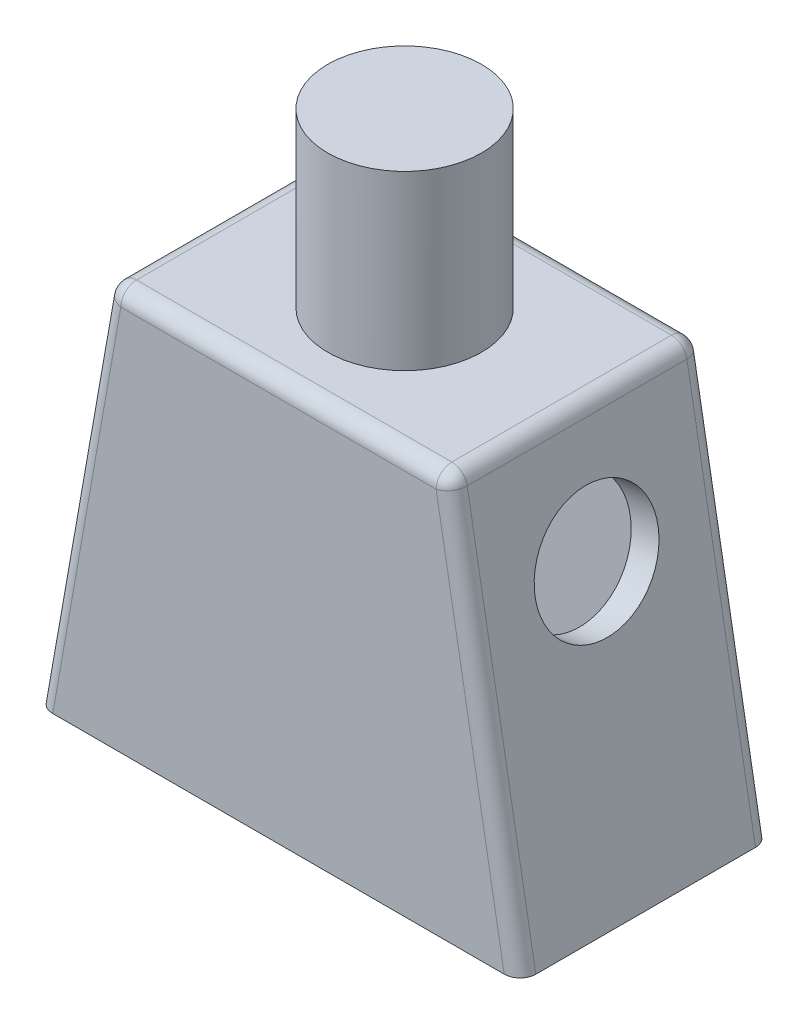
ISO-10303-21;
HEADER;
FILE_DESCRIPTION(('STEP AP214'),'2;1');
FILE_NAME('part.step','',(''),(''),'','','');
FILE_SCHEMA(('AUTOMOTIVE_DESIGN { 1 0 10303 214 1 1 1 1 }'));
ENDSEC;
DATA;
#1=APPLICATION_CONTEXT('core data for automotive mechanical design processes');
#2=APPLICATION_PROTOCOL_DEFINITION('international standard','automotive_design',2000,#1);
#3=PRODUCT_CONTEXT('',#1,'mechanical');
#4=PRODUCT('Part','Part','',(#3));
#5=PRODUCT_RELATED_PRODUCT_CATEGORY('part','',(#4));
#6=PRODUCT_DEFINITION_FORMATION('','',#4);
#7=PRODUCT_DEFINITION_CONTEXT('part definition',#1,'design');
#8=PRODUCT_DEFINITION('design','',#6,#7);
#9=PRODUCT_DEFINITION_SHAPE('','',#8);
#10=(LENGTH_UNIT() NAMED_UNIT(*) SI_UNIT(.MILLI.,.METRE.));
#11=(NAMED_UNIT(*) PLANE_ANGLE_UNIT() SI_UNIT($,.RADIAN.));
#12=(NAMED_UNIT(*) SI_UNIT($,.STERADIAN.) SOLID_ANGLE_UNIT());
#13=UNCERTAINTY_MEASURE_WITH_UNIT(LENGTH_MEASURE(1.E-05),#10,'distance_accuracy_value','');
#14=(GEOMETRIC_REPRESENTATION_CONTEXT(3) GLOBAL_UNCERTAINTY_ASSIGNED_CONTEXT((#13)) GLOBAL_UNIT_ASSIGNED_CONTEXT((#10,
#11,#12)) REPRESENTATION_CONTEXT('',''));
#15=CARTESIAN_POINT('',(0.,0.,0.));
#16=DIRECTION('',(0.,0.,1.));
#17=DIRECTION('',(1.,0.,0.));
#18=AXIS2_PLACEMENT_3D('',#15,#16,#17);
#19=CARTESIAN_POINT('',(0.,0.,8.));
#20=DIRECTION('',(0.984807753012209,-0.173648177666927,0.));
#21=DIRECTION('',(0.173648177666927,0.984807753012209,0.));
#22=AXIS2_PLACEMENT_3D('',#19,#20,#21);
#23=PLANE('',#22);
#24=CARTESIAN_POINT('',(1.56283359900235,8.86326977710988,4.));
#25=DIRECTION('',(-0.984807753012209,0.173648177666927,0.));
#26=DIRECTION('',(-0.173648177666927,-0.984807753012209,0.));
#27=AXIS2_PLACEMENT_3D('',#24,#25,#26);
#28=CIRCLE('',#27,2.);
#29=CARTESIAN_POINT('',(1.21553724366849,6.89365427108546,4.));
#30=VERTEX_POINT('',#29);
#31=EDGE_CURVE('E270',#30,#30,#28,.T.);
#32=ORIENTED_EDGE('',*,*,#31,.F.);
#33=EDGE_LOOP('',(#32));
#34=FACE_BOUND('',#33,.T.);
#35=DIRECTION('',(0.,0.,-1.));
#36=VECTOR('',#35,1.);
#37=CARTESIAN_POINT('',(2.18413129215085,12.3868240888335,8.));
#38=LINE('',#37,#36);
#39=CARTESIAN_POINT('',(2.18413129215085,12.3868240888335,7.5));
#40=VERTEX_POINT('',#39);
#41=CARTESIAN_POINT('',(2.18413129215085,12.3868240888335,0.5));
#42=VERTEX_POINT('',#41);
#43=EDGE_CURVE('E199',#40,#42,#38,.T.);
#44=ORIENTED_EDGE('',*,*,#43,.T.);
#45=DIRECTION('',(-0.173648177666927,-0.984807753012209,0.));
#46=VECTOR('',#45,1.);
#47=CARTESIAN_POINT('',(0.,0.,0.5));
#48=LINE('',#47,#46);
#49=CARTESIAN_POINT('',(0.,0.,0.5));
#50=VERTEX_POINT('',#49);
#51=EDGE_CURVE('E203',#42,#50,#48,.T.);
#52=ORIENTED_EDGE('',*,*,#51,.T.);
#53=DIRECTION('',(0.,0.,-1.));
#54=VECTOR('',#53,1.);
#55=CARTESIAN_POINT('',(0.,0.,8.));
#56=LINE('',#55,#54);
#57=CARTESIAN_POINT('',(0.,0.,7.5));
#58=VERTEX_POINT('',#57);
#59=EDGE_CURVE('E196',#58,#50,#56,.T.);
#60=ORIENTED_EDGE('',*,*,#59,.F.);
#61=DIRECTION('',(-0.173648177666927,-0.984807753012209,0.));
#62=VECTOR('',#61,1.);
#63=CARTESIAN_POINT('',(0.,0.,7.5));
#64=LINE('',#63,#62);
#65=EDGE_CURVE('E201',#58,#40,#64,.F.);
#66=ORIENTED_EDGE('',*,*,#65,.T.);
#67=EDGE_LOOP('',(#44,#52,#60,#66));
#68=FACE_BOUND('',#67,.T.);
#69=ADVANCED_FACE('F39',(#34,#68),#23,.F.);
#70=CARTESIAN_POINT('',(0.,0.,8.));
#71=DIRECTION('',(0.,1.,0.));
#72=DIRECTION('',(0.,0.,1.));
#73=AXIS2_PLACEMENT_3D('',#70,#71,#72);
#74=PLANE('',#73);
#75=DIRECTION('',(0.,0.,1.));
#76=VECTOR('',#75,1.);
#77=CARTESIAN_POINT('',(14.2216255782401,0.,1.5));
#78=LINE('',#77,#76);
#79=CARTESIAN_POINT('',(14.2216255782401,0.,1.5));
#80=VERTEX_POINT('',#79);
#81=CARTESIAN_POINT('',(14.2216255782401,0.,6.5));
#82=VERTEX_POINT('',#81);
#83=EDGE_CURVE('E157',#80,#82,#78,.T.);
#84=ORIENTED_EDGE('',*,*,#83,.F.);
#85=DIRECTION('',(1.,0.,0.));
#86=VECTOR('',#85,1.);
#87=CARTESIAN_POINT('',(1.17837442175986,0.,1.5));
#88=LINE('',#87,#86);
#89=CARTESIAN_POINT('',(1.17837442175986,0.,1.5));
#90=VERTEX_POINT('',#89);
#91=EDGE_CURVE('E164',#90,#80,#88,.T.);
#92=ORIENTED_EDGE('',*,*,#91,.F.);
#93=DIRECTION('',(0.,0.,1.));
#94=VECTOR('',#93,1.);
#95=CARTESIAN_POINT('',(1.17837442175986,0.,1.5));
#96=LINE('',#95,#94);
#97=CARTESIAN_POINT('',(1.17837442175986,0.,6.5));
#98=VERTEX_POINT('',#97);
#99=EDGE_CURVE('E193',#90,#98,#96,.T.);
#100=ORIENTED_EDGE('',*,*,#99,.T.);
#101=DIRECTION('',(1.,0.,0.));
#102=VECTOR('',#101,1.);
#103=CARTESIAN_POINT('',(1.17837442175986,0.,6.5));
#104=LINE('',#103,#102);
#105=EDGE_CURVE('E178',#98,#82,#104,.T.);
#106=ORIENTED_EDGE('',*,*,#105,.T.);
#107=EDGE_LOOP('',(#84,#92,#100,#106));
#108=FACE_BOUND('',#107,.T.);
#109=ORIENTED_EDGE('',*,*,#59,.T.);
#110=CARTESIAN_POINT('',(0.507713305942872,0.,0.5));
#111=DIRECTION('',(0.,1.,0.));
#112=DIRECTION('',(1.,0.,0.));
#113=AXIS2_PLACEMENT_3D('',#110,#111,#112);
#114=ELLIPSE('',#113,0.507713305942872,0.5);
#115=CARTESIAN_POINT('',(0.507713305942872,0.,0.));
#116=VERTEX_POINT('',#115);
#117=EDGE_CURVE('E212',#50,#116,#114,.F.);
#118=ORIENTED_EDGE('',*,*,#117,.T.);
#119=DIRECTION('',(1.,0.,0.));
#120=VECTOR('',#119,1.);
#121=CARTESIAN_POINT('',(0.,0.,0.));
#122=LINE('',#121,#120);
#123=CARTESIAN_POINT('',(14.8922866940571,0.,0.));
#124=VERTEX_POINT('',#123);
#125=EDGE_CURVE('E190',#116,#124,#122,.T.);
#126=ORIENTED_EDGE('',*,*,#125,.T.);
#127=CARTESIAN_POINT('',(14.8922866940571,0.,0.5));
#128=DIRECTION('',(0.,1.,0.));
#129=DIRECTION('',(1.,0.,0.));
#130=AXIS2_PLACEMENT_3D('',#127,#128,#129);
#131=ELLIPSE('',#130,0.507713305942872,0.5);
#132=CARTESIAN_POINT('',(15.4,0.,0.5));
#133=VERTEX_POINT('',#132);
#134=EDGE_CURVE('E210',#124,#133,#131,.F.);
#135=ORIENTED_EDGE('',*,*,#134,.T.);
#136=DIRECTION('',(0.,0.,-1.));
#137=VECTOR('',#136,1.);
#138=CARTESIAN_POINT('',(15.4,0.,8.));
#139=LINE('',#138,#137);
#140=CARTESIAN_POINT('',(15.4,0.,7.5));
#141=VERTEX_POINT('',#140);
#142=EDGE_CURVE('E189',#141,#133,#139,.T.);
#143=ORIENTED_EDGE('',*,*,#142,.F.);
#144=CARTESIAN_POINT('',(14.8922866940571,0.,7.5));
#145=DIRECTION('',(0.,1.,0.));
#146=DIRECTION('',(-1.,0.,0.));
#147=AXIS2_PLACEMENT_3D('',#144,#145,#146);
#148=ELLIPSE('',#147,0.507713305942872,0.5);
#149=CARTESIAN_POINT('',(14.8922866940571,0.,8.));
#150=VERTEX_POINT('',#149);
#151=EDGE_CURVE('E208',#141,#150,#148,.F.);
#152=ORIENTED_EDGE('',*,*,#151,.T.);
#153=DIRECTION('',(1.,0.,0.));
#154=VECTOR('',#153,1.);
#155=CARTESIAN_POINT('',(0.,0.,8.));
#156=LINE('',#155,#154);
#157=CARTESIAN_POINT('',(0.507713305942872,0.,8.));
#158=VERTEX_POINT('',#157);
#159=EDGE_CURVE('E186',#158,#150,#156,.T.);
#160=ORIENTED_EDGE('',*,*,#159,.F.);
#161=CARTESIAN_POINT('',(0.507713305942872,0.,7.5));
#162=DIRECTION('',(0.,1.,0.));
#163=DIRECTION('',(-1.,0.,0.));
#164=AXIS2_PLACEMENT_3D('',#161,#162,#163);
#165=ELLIPSE('',#164,0.507713305942872,0.5);
#166=EDGE_CURVE('E206',#158,#58,#165,.F.);
#167=ORIENTED_EDGE('',*,*,#166,.T.);
#168=EDGE_LOOP('',(#109,#118,#126,#135,#143,#152,#160,#167));
#169=FACE_BOUND('',#168,.T.);
#170=ADVANCED_FACE('F176',(#108,#169),#74,.F.);
#171=CARTESIAN_POINT('',(13.1430146469317,12.8,8.));
#172=DIRECTION('',(-0.984807753012209,-0.173648177666927,0.));
#173=DIRECTION('',(0.173648177666927,-0.984807753012209,0.));
#174=AXIS2_PLACEMENT_3D('',#171,#172,#173);
#175=PLANE('',#174);
#176=ORIENTED_EDGE('',*,*,#142,.T.);
#177=DIRECTION('',(-0.173648177666927,0.984807753012209,0.));
#178=VECTOR('',#177,1.);
#179=CARTESIAN_POINT('',(13.1430146469317,12.8,0.5));
#180=LINE('',#179,#178);
#181=CARTESIAN_POINT('',(13.2158687078492,12.3868240888335,0.5));
#182=VERTEX_POINT('',#181);
#183=EDGE_CURVE('E224',#133,#182,#180,.T.);
#184=ORIENTED_EDGE('',*,*,#183,.T.);
#185=DIRECTION('',(0.,0.,-1.));
#186=VECTOR('',#185,1.);
#187=CARTESIAN_POINT('',(13.2158687078492,12.3868240888335,8.));
#188=LINE('',#187,#186);
#189=CARTESIAN_POINT('',(13.2158687078492,12.3868240888335,7.5));
#190=VERTEX_POINT('',#189);
#191=EDGE_CURVE('E220',#182,#190,#188,.F.);
#192=ORIENTED_EDGE('',*,*,#191,.T.);
#193=DIRECTION('',(-0.173648177666927,0.984807753012209,0.));
#194=VECTOR('',#193,1.);
#195=CARTESIAN_POINT('',(13.1430146469317,12.8,7.5));
#196=LINE('',#195,#194);
#197=EDGE_CURVE('E222',#190,#141,#196,.F.);
#198=ORIENTED_EDGE('',*,*,#197,.T.);
#199=EDGE_LOOP('',(#176,#184,#192,#198));
#200=FACE_BOUND('',#199,.T.);
#201=CARTESIAN_POINT('',(13.8371664009977,8.86326977710988,4.));
#202=DIRECTION('',(0.984807753012209,0.173648177666927,0.));
#203=DIRECTION('',(-0.173648177666927,0.984807753012209,0.));
#204=AXIS2_PLACEMENT_3D('',#201,#202,#203);
#205=CIRCLE('',#204,1.96);
#206=CARTESIAN_POINT('',(13.4968159727705,10.7934929730138,4.));
#207=VERTEX_POINT('',#206);
#208=EDGE_CURVE('E281',#207,#207,#205,.T.);
#209=ORIENTED_EDGE('',*,*,#208,.F.);
#210=EDGE_LOOP('',(#209));
#211=FACE_BOUND('',#210,.T.);
#212=ADVANCED_FACE('F345',(#200,#211),#175,.F.);
#213=CARTESIAN_POINT('',(2.25698535306831,12.8,8.));
#214=DIRECTION('',(0.,-1.,0.));
#215=DIRECTION('',(0.,0.,-1.));
#216=AXIS2_PLACEMENT_3D('',#213,#214,#215);
#217=PLANE('',#216);
#218=CARTESIAN_POINT('',(7.72,12.8,4.));
#219=DIRECTION('',(0.,-1.,0.));
#220=DIRECTION('',(0.,0.,-1.));
#221=AXIS2_PLACEMENT_3D('',#218,#219,#220);
#222=CIRCLE('',#221,2.45);
#223=CARTESIAN_POINT('',(7.72,12.8,1.55));
#224=VERTEX_POINT('',#223);
#225=EDGE_CURVE('E11',#224,#224,#222,.F.);
#226=ORIENTED_EDGE('',*,*,#225,.F.);
#227=EDGE_LOOP('',(#226));
#228=FACE_BOUND('',#227,.T.);
#229=DIRECTION('',(0.,0.,-1.));
#230=VECTOR('',#229,1.);
#231=CARTESIAN_POINT('',(12.723464831343,12.8,8.));
#232=LINE('',#231,#230);
#233=CARTESIAN_POINT('',(12.723464831343,12.8,7.5));
#234=VERTEX_POINT('',#233);
#235=CARTESIAN_POINT('',(12.723464831343,12.8,0.5));
#236=VERTEX_POINT('',#235);
#237=EDGE_CURVE('E54',#234,#236,#232,.T.);
#238=ORIENTED_EDGE('',*,*,#237,.T.);
#239=DIRECTION('',(-1.,0.,0.));
#240=VECTOR('',#239,1.);
#241=CARTESIAN_POINT('',(2.25698535306831,12.8,0.5));
#242=LINE('',#241,#240);
#243=CARTESIAN_POINT('',(2.67653516865695,12.8,0.5));
#244=VERTEX_POINT('',#243);
#245=EDGE_CURVE('E47',#236,#244,#242,.T.);
#246=ORIENTED_EDGE('',*,*,#245,.T.);
#247=DIRECTION('',(0.,0.,-1.));
#248=VECTOR('',#247,1.);
#249=CARTESIAN_POINT('',(2.67653516865695,12.8,8.));
#250=LINE('',#249,#248);
#251=CARTESIAN_POINT('',(2.67653516865695,12.8,7.5));
#252=VERTEX_POINT('',#251);
#253=EDGE_CURVE('E232',#244,#252,#250,.F.);
#254=ORIENTED_EDGE('',*,*,#253,.T.);
#255=DIRECTION('',(-1.,0.,0.));
#256=VECTOR('',#255,1.);
#257=CARTESIAN_POINT('',(2.25698535306831,12.8,7.5));
#258=LINE('',#257,#256);
#259=EDGE_CURVE('E59',#252,#234,#258,.F.);
#260=ORIENTED_EDGE('',*,*,#259,.T.);
#261=EDGE_LOOP('',(#238,#246,#254,#260));
#262=FACE_BOUND('',#261,.T.);
#263=ADVANCED_FACE('F425',(#228,#262),#217,.F.);
#264=CARTESIAN_POINT('',(0.,0.,8.));
#265=DIRECTION('',(0.,0.,-1.));
#266=DIRECTION('',(-1.,0.,0.));
#267=AXIS2_PLACEMENT_3D('',#264,#265,#266);
#268=PLANE('',#267);
#269=ORIENTED_EDGE('',*,*,#159,.T.);
#270=DIRECTION('',(-0.173648177666927,0.984807753012209,0.));
#271=VECTOR('',#270,1.);
#272=CARTESIAN_POINT('',(14.4432293035454,2.54673101477414,8.));
#273=LINE('',#272,#271);
#274=CARTESIAN_POINT('',(12.723464831343,12.3,8.));
#275=VERTEX_POINT('',#274);
#276=EDGE_CURVE('E230',#150,#275,#273,.T.);
#277=ORIENTED_EDGE('',*,*,#276,.T.);
#278=DIRECTION('',(-1.,0.,0.));
#279=VECTOR('',#278,1.);
#280=CARTESIAN_POINT('',(0.,12.3,8.));
#281=LINE('',#280,#279);
#282=CARTESIAN_POINT('',(2.67653516865695,12.3,8.));
#283=VERTEX_POINT('',#282);
#284=EDGE_CURVE('E226',#275,#283,#281,.T.);
#285=ORIENTED_EDGE('',*,*,#284,.T.);
#286=DIRECTION('',(-0.173648177666927,-0.984807753012209,0.));
#287=VECTOR('',#286,1.);
#288=CARTESIAN_POINT('',(0.492403876506104,-0.0868240888334637,8.));
#289=LINE('',#288,#287);
#290=EDGE_CURVE('E228',#283,#158,#289,.T.);
#291=ORIENTED_EDGE('',*,*,#290,.T.);
#292=EDGE_LOOP('',(#269,#277,#285,#291));
#293=FACE_BOUND('',#292,.T.);
#294=ADVANCED_FACE('F401',(#293),#268,.F.);
#295=CARTESIAN_POINT('',(0.,0.,0.));
#296=DIRECTION('',(0.,0.,-1.));
#297=DIRECTION('',(-1.,0.,0.));
#298=AXIS2_PLACEMENT_3D('',#295,#296,#297);
#299=PLANE('',#298);
#300=ORIENTED_EDGE('',*,*,#125,.F.);
#301=DIRECTION('',(-0.173648177666927,-0.984807753012209,0.));
#302=VECTOR('',#301,1.);
#303=CARTESIAN_POINT('',(2.74938922957442,12.7131759111665,0.));
#304=LINE('',#303,#302);
#305=CARTESIAN_POINT('',(2.67653516865695,12.3,0.));
#306=VERTEX_POINT('',#305);
#307=EDGE_CURVE('E218',#116,#306,#304,.F.);
#308=ORIENTED_EDGE('',*,*,#307,.T.);
#309=DIRECTION('',(-1.,0.,0.));
#310=VECTOR('',#309,1.);
#311=CARTESIAN_POINT('',(13.1430146469317,12.3,0.));
#312=LINE('',#311,#310);
#313=CARTESIAN_POINT('',(12.723464831343,12.3,0.));
#314=VERTEX_POINT('',#313);
#315=EDGE_CURVE('E214',#306,#314,#312,.F.);
#316=ORIENTED_EDGE('',*,*,#315,.T.);
#317=DIRECTION('',(-0.173648177666927,0.984807753012209,0.));
#318=VECTOR('',#317,1.);
#319=CARTESIAN_POINT('',(14.9075961234939,-0.0868240888334659,0.));
#320=LINE('',#319,#318);
#321=EDGE_CURVE('E216',#314,#124,#320,.F.);
#322=ORIENTED_EDGE('',*,*,#321,.T.);
#323=EDGE_LOOP('',(#300,#308,#316,#322));
#324=FACE_BOUND('',#323,.T.);
#325=ADVANCED_FACE('F337',(#324),#299,.T.);
#326=CARTESIAN_POINT('',(1.17837442175986,0.,1.5));
#327=DIRECTION('',(-1.,0.,0.));
#328=DIRECTION('',(0.,0.,1.));
#329=AXIS2_PLACEMENT_3D('',#326,#327,#328);
#330=PLANE('',#329);
#331=DIRECTION('',(0.,-1.,0.));
#332=VECTOR('',#331,1.);
#333=CARTESIAN_POINT('',(1.17837442175986,0.,6.5));
#334=LINE('',#333,#332);
#335=CARTESIAN_POINT('',(1.17837442175986,1.5,6.5));
#336=VERTEX_POINT('',#335);
#337=EDGE_CURVE('E174',#336,#98,#334,.T.);
#338=ORIENTED_EDGE('',*,*,#337,.T.);
#339=ORIENTED_EDGE('',*,*,#99,.F.);
#340=DIRECTION('',(0.,-1.,0.));
#341=VECTOR('',#340,1.);
#342=CARTESIAN_POINT('',(1.17837442175986,0.,1.5));
#343=LINE('',#342,#341);
#344=CARTESIAN_POINT('',(1.17837442175986,1.5,1.5));
#345=VERTEX_POINT('',#344);
#346=EDGE_CURVE('E171',#345,#90,#343,.T.);
#347=ORIENTED_EDGE('',*,*,#346,.F.);
#348=DIRECTION('',(0.,0.,1.));
#349=VECTOR('',#348,1.);
#350=CARTESIAN_POINT('',(1.17837442175986,1.5,1.5));
#351=LINE('',#350,#349);
#352=EDGE_CURVE('E310',#345,#336,#351,.T.);
#353=ORIENTED_EDGE('',*,*,#352,.T.);
#354=EDGE_LOOP('',(#338,#339,#347,#353));
#355=FACE_BOUND('',#354,.T.);
#356=ADVANCED_FACE('F327',(#355),#330,.F.);
#357=CARTESIAN_POINT('',(1.17837442175986,1.5,1.5));
#358=DIRECTION('',(-0.984807753012209,0.173648177666928,0.));
#359=DIRECTION('',(-0.173648177666928,-0.984807753012209,0.));
#360=AXIS2_PLACEMENT_3D('',#357,#358,#359);
#361=PLANE('',#360);
#362=CARTESIAN_POINT('',(2.44916057671333,8.70698641720964,4.));
#363=DIRECTION('',(-0.984807753012209,0.173648177666927,0.));
#364=DIRECTION('',(-0.173648177666927,-0.984807753012209,0.));
#365=AXIS2_PLACEMENT_3D('',#362,#363,#364);
#366=CIRCLE('',#365,2.);
#367=CARTESIAN_POINT('',(2.10186422137948,6.73737091118523,4.));
#368=VERTEX_POINT('',#367);
#369=EDGE_CURVE('E276',#368,#368,#366,.T.);
#370=ORIENTED_EDGE('',*,*,#369,.T.);
#371=EDGE_LOOP('',(#370));
#372=FACE_BOUND('',#371,.T.);
#373=DIRECTION('',(-0.173648177666928,-0.984807753012208,0.));
#374=VECTOR('',#373,1.);
#375=CARTESIAN_POINT('',(1.17837442175986,1.5,6.5));
#376=LINE('',#375,#374);
#377=CARTESIAN_POINT('',(3.01217502112787,11.9,6.5));
#378=VERTEX_POINT('',#377);
#379=EDGE_CURVE('E304',#378,#336,#376,.T.);
#380=ORIENTED_EDGE('',*,*,#379,.T.);
#381=ORIENTED_EDGE('',*,*,#352,.F.);
#382=DIRECTION('',(-0.173648177666928,-0.984807753012208,0.));
#383=VECTOR('',#382,1.);
#384=CARTESIAN_POINT('',(1.17837442175986,1.5,1.5));
#385=LINE('',#384,#383);
#386=CARTESIAN_POINT('',(3.01217502112787,11.9,1.5));
#387=VERTEX_POINT('',#386);
#388=EDGE_CURVE('E182',#387,#345,#385,.T.);
#389=ORIENTED_EDGE('',*,*,#388,.F.);
#390=DIRECTION('',(0.,0.,1.));
#391=VECTOR('',#390,1.);
#392=CARTESIAN_POINT('',(3.01217502112787,11.9,1.5));
#393=LINE('',#392,#391);
#394=EDGE_CURVE('E312',#387,#378,#393,.T.);
#395=ORIENTED_EDGE('',*,*,#394,.T.);
#396=EDGE_LOOP('',(#380,#381,#389,#395));
#397=FACE_BOUND('',#396,.T.);
#398=ADVANCED_FACE('F328',(#372,#397),#361,.F.);
#399=CARTESIAN_POINT('',(3.01217502112787,11.9,1.5));
#400=DIRECTION('',(0.,1.,0.));
#401=DIRECTION('',(0.,0.,1.));
#402=AXIS2_PLACEMENT_3D('',#399,#400,#401);
#403=PLANE('',#402);
#404=DIRECTION('',(-1.,0.,0.));
#405=VECTOR('',#404,1.);
#406=CARTESIAN_POINT('',(3.01217502112787,11.9,6.5));
#407=LINE('',#406,#405);
#408=CARTESIAN_POINT('',(12.3878249788721,11.9,6.5));
#409=VERTEX_POINT('',#408);
#410=EDGE_CURVE('E301',#409,#378,#407,.T.);
#411=ORIENTED_EDGE('',*,*,#410,.T.);
#412=ORIENTED_EDGE('',*,*,#394,.F.);
#413=DIRECTION('',(-1.,0.,0.));
#414=VECTOR('',#413,1.);
#415=CARTESIAN_POINT('',(3.01217502112787,11.9,1.5));
#416=LINE('',#415,#414);
#417=CARTESIAN_POINT('',(12.3878249788721,11.9,1.5));
#418=VERTEX_POINT('',#417);
#419=EDGE_CURVE('E291',#418,#387,#416,.T.);
#420=ORIENTED_EDGE('',*,*,#419,.F.);
#421=DIRECTION('',(0.,0.,1.));
#422=VECTOR('',#421,1.);
#423=CARTESIAN_POINT('',(12.3878249788721,11.9,1.5));
#424=LINE('',#423,#422);
#425=EDGE_CURVE('E180',#418,#409,#424,.T.);
#426=ORIENTED_EDGE('',*,*,#425,.T.);
#427=EDGE_LOOP('',(#411,#412,#420,#426));
#428=FACE_BOUND('',#427,.T.);
#429=ADVANCED_FACE('F316',(#428),#403,.F.);
#430=CARTESIAN_POINT('',(12.3878249788721,11.9,1.5));
#431=DIRECTION('',(0.984807753012209,0.173648177666927,0.));
#432=DIRECTION('',(-0.173648177666927,0.984807753012209,0.));
#433=AXIS2_PLACEMENT_3D('',#430,#431,#432);
#434=PLANE('',#433);
#435=CARTESIAN_POINT('',(12.9508394232867,8.70698641720964,4.));
#436=DIRECTION('',(0.984807753012209,0.173648177666927,0.));
#437=DIRECTION('',(-0.173648177666927,0.984807753012209,0.));
#438=AXIS2_PLACEMENT_3D('',#435,#436,#437);
#439=CIRCLE('',#438,1.96);
#440=CARTESIAN_POINT('',(12.6104889950595,10.6372096131136,4.));
#441=VERTEX_POINT('',#440);
#442=EDGE_CURVE('E285',#441,#441,#439,.T.);
#443=ORIENTED_EDGE('',*,*,#442,.T.);
#444=EDGE_LOOP('',(#443));
#445=FACE_BOUND('',#444,.T.);
#446=DIRECTION('',(-0.173648177666927,0.984807753012209,0.));
#447=VECTOR('',#446,1.);
#448=CARTESIAN_POINT('',(12.3878249788721,11.9,6.5));
#449=LINE('',#448,#447);
#450=CARTESIAN_POINT('',(14.2216255782401,1.5,6.5));
#451=VERTEX_POINT('',#450);
#452=EDGE_CURVE('E298',#451,#409,#449,.T.);
#453=ORIENTED_EDGE('',*,*,#452,.T.);
#454=ORIENTED_EDGE('',*,*,#425,.F.);
#455=DIRECTION('',(-0.173648177666927,0.984807753012209,0.));
#456=VECTOR('',#455,1.);
#457=CARTESIAN_POINT('',(12.3878249788721,11.9,1.5));
#458=LINE('',#457,#456);
#459=CARTESIAN_POINT('',(14.2216255782401,1.5,1.5));
#460=VERTEX_POINT('',#459);
#461=EDGE_CURVE('E163',#460,#418,#458,.T.);
#462=ORIENTED_EDGE('',*,*,#461,.F.);
#463=DIRECTION('',(0.,0.,1.));
#464=VECTOR('',#463,1.);
#465=CARTESIAN_POINT('',(14.2216255782401,1.5,1.5));
#466=LINE('',#465,#464);
#467=EDGE_CURVE('E159',#460,#451,#466,.T.);
#468=ORIENTED_EDGE('',*,*,#467,.T.);
#469=EDGE_LOOP('',(#453,#454,#462,#468));
#470=FACE_BOUND('',#469,.T.);
#471=ADVANCED_FACE('F323',(#445,#470),#434,.F.);
#472=CARTESIAN_POINT('',(14.2216255782401,1.5,1.5));
#473=DIRECTION('',(1.,0.,0.));
#474=DIRECTION('',(0.,0.,-1.));
#475=AXIS2_PLACEMENT_3D('',#472,#473,#474);
#476=PLANE('',#475);
#477=DIRECTION('',(0.,1.,0.));
#478=VECTOR('',#477,1.);
#479=CARTESIAN_POINT('',(14.2216255782401,1.5,6.5));
#480=LINE('',#479,#478);
#481=EDGE_CURVE('E296',#82,#451,#480,.T.);
#482=ORIENTED_EDGE('',*,*,#481,.T.);
#483=ORIENTED_EDGE('',*,*,#467,.F.);
#484=DIRECTION('',(0.,1.,0.));
#485=VECTOR('',#484,1.);
#486=CARTESIAN_POINT('',(14.2216255782401,1.5,1.5));
#487=LINE('',#486,#485);
#488=EDGE_CURVE('E152',#80,#460,#487,.T.);
#489=ORIENTED_EDGE('',*,*,#488,.F.);
#490=ORIENTED_EDGE('',*,*,#83,.T.);
#491=EDGE_LOOP('',(#482,#483,#489,#490));
#492=FACE_BOUND('',#491,.T.);
#493=ADVANCED_FACE('F155',(#492),#476,.F.);
#494=CARTESIAN_POINT('',(0.,0.,1.5));
#495=DIRECTION('',(0.,0.,-1.));
#496=DIRECTION('',(-1.,0.,0.));
#497=AXIS2_PLACEMENT_3D('',#494,#495,#496);
#498=PLANE('',#497);
#499=ORIENTED_EDGE('',*,*,#91,.T.);
#500=ORIENTED_EDGE('',*,*,#488,.T.);
#501=ORIENTED_EDGE('',*,*,#461,.T.);
#502=ORIENTED_EDGE('',*,*,#419,.T.);
#503=ORIENTED_EDGE('',*,*,#388,.T.);
#504=ORIENTED_EDGE('',*,*,#346,.T.);
#505=EDGE_LOOP('',(#499,#500,#501,#502,#503,#504));
#506=FACE_BOUND('',#505,.T.);
#507=ADVANCED_FACE('F168',(#506),#498,.F.);
#508=CARTESIAN_POINT('',(0.,0.,6.5));
#509=DIRECTION('',(0.,0.,-1.));
#510=DIRECTION('',(-1.,0.,0.));
#511=AXIS2_PLACEMENT_3D('',#508,#509,#510);
#512=PLANE('',#511);
#513=ORIENTED_EDGE('',*,*,#105,.F.);
#514=ORIENTED_EDGE('',*,*,#337,.F.);
#515=ORIENTED_EDGE('',*,*,#379,.F.);
#516=ORIENTED_EDGE('',*,*,#410,.F.);
#517=ORIENTED_EDGE('',*,*,#452,.F.);
#518=ORIENTED_EDGE('',*,*,#481,.F.);
#519=EDGE_LOOP('',(#513,#514,#515,#516,#517,#518));
#520=FACE_BOUND('',#519,.T.);
#521=ADVANCED_FACE('F321',(#520),#512,.T.);
#522=CARTESIAN_POINT('',(12.9508394232867,8.70698641720964,4.));
#523=DIRECTION('',(0.984807753012209,0.173648177666927,0.));
#524=DIRECTION('',(-0.173648177666927,0.984807753012209,0.));
#525=AXIS2_PLACEMENT_3D('',#522,#523,#524);
#526=CYLINDRICAL_SURFACE('',#525,1.96);
#527=ORIENTED_EDGE('',*,*,#442,.F.);
#528=EDGE_LOOP('',(#527));
#529=FACE_BOUND('',#528,.T.);
#530=ORIENTED_EDGE('',*,*,#208,.T.);
#531=EDGE_LOOP('',(#530));
#532=FACE_BOUND('',#531,.T.);
#533=ADVANCED_FACE('F447',(#529,#532),#526,.F.);
#534=CARTESIAN_POINT('',(2.44916057671333,8.70698641720964,4.));
#535=DIRECTION('',(-0.984807753012209,0.173648177666927,0.));
#536=DIRECTION('',(-0.173648177666927,-0.984807753012209,0.));
#537=AXIS2_PLACEMENT_3D('',#534,#535,#536);
#538=CYLINDRICAL_SURFACE('',#537,2.);
#539=ORIENTED_EDGE('',*,*,#369,.F.);
#540=EDGE_LOOP('',(#539));
#541=FACE_BOUND('',#540,.T.);
#542=ORIENTED_EDGE('',*,*,#31,.T.);
#543=EDGE_LOOP('',(#542));
#544=FACE_BOUND('',#543,.T.);
#545=ADVANCED_FACE('F395',(#541,#544),#538,.F.);
#546=CARTESIAN_POINT('',(14.4432293035454,2.54673101477414,7.5));
#547=DIRECTION('',(-0.173648177666927,0.984807753012209,0.));
#548=DIRECTION('',(-0.984807753012209,-0.173648177666927,0.));
#549=AXIS2_PLACEMENT_3D('',#546,#547,#548);
#550=CYLINDRICAL_SURFACE('',#549,0.5);
#551=CARTESIAN_POINT('',(12.723464831343,12.3,7.5));
#552=DIRECTION('',(-0.173648177666928,0.984807753012208,0.));
#553=DIRECTION('',(-0.984807753012208,-0.173648177666928,0.));
#554=AXIS2_PLACEMENT_3D('',#551,#552,#553);
#555=CIRCLE('',#554,0.5);
#556=EDGE_CURVE('E268',#275,#190,#555,.T.);
#557=ORIENTED_EDGE('',*,*,#556,.F.);
#558=ORIENTED_EDGE('',*,*,#276,.F.);
#559=ORIENTED_EDGE('',*,*,#151,.F.);
#560=ORIENTED_EDGE('',*,*,#197,.F.);
#561=EDGE_LOOP('',(#557,#558,#559,#560));
#562=FACE_BOUND('',#561,.T.);
#563=ADVANCED_FACE('F41',(#562),#550,.T.);
#564=CARTESIAN_POINT('',(12.723464831343,12.3,7.5));
#565=DIRECTION('',(0.,0.,1.));
#566=DIRECTION('',(1.,0.,0.));
#567=AXIS2_PLACEMENT_3D('',#564,#565,#566);
#568=SPHERICAL_SURFACE('',#567,0.5);
#569=CARTESIAN_POINT('',(12.723464831343,12.3,7.5));
#570=DIRECTION('',(1.,0.,0.));
#571=DIRECTION('',(0.,0.,-1.));
#572=AXIS2_PLACEMENT_3D('',#569,#570,#571);
#573=CIRCLE('',#572,0.5);
#574=EDGE_CURVE('E264',#275,#234,#573,.F.);
#575=ORIENTED_EDGE('',*,*,#574,.F.);
#576=ORIENTED_EDGE('',*,*,#556,.T.);
#577=CARTESIAN_POINT('',(12.723464831343,12.3,7.5));
#578=DIRECTION('',(0.,0.,1.));
#579=DIRECTION('',(1.,0.,0.));
#580=AXIS2_PLACEMENT_3D('',#577,#578,#579);
#581=CIRCLE('',#580,0.5);
#582=EDGE_CURVE('E266',#234,#190,#581,.F.);
#583=ORIENTED_EDGE('',*,*,#582,.F.);
#584=EDGE_LOOP('',(#575,#576,#583));
#585=FACE_BOUND('',#584,.T.);
#586=ADVANCED_FACE('F389',(#585),#568,.T.);
#587=CARTESIAN_POINT('',(12.6506107704256,12.7131759111665,0.5));
#588=DIRECTION('',(0.173648177666927,-0.984807753012209,0.));
#589=DIRECTION('',(0.984807753012209,0.173648177666927,0.));
#590=AXIS2_PLACEMENT_3D('',#587,#588,#589);
#591=CYLINDRICAL_SURFACE('',#590,0.5);
#592=ORIENTED_EDGE('',*,*,#134,.F.);
#593=ORIENTED_EDGE('',*,*,#321,.F.);
#594=CARTESIAN_POINT('',(12.723464831343,12.3,0.5));
#595=DIRECTION('',(-0.173648177666928,0.984807753012208,0.));
#596=DIRECTION('',(-0.984807753012208,-0.173648177666928,0.));
#597=AXIS2_PLACEMENT_3D('',#594,#595,#596);
#598=CIRCLE('',#597,0.5);
#599=EDGE_CURVE('E261',#182,#314,#598,.T.);
#600=ORIENTED_EDGE('',*,*,#599,.F.);
#601=ORIENTED_EDGE('',*,*,#183,.F.);
#602=EDGE_LOOP('',(#592,#593,#600,#601));
#603=FACE_BOUND('',#602,.T.);
#604=ADVANCED_FACE('F386',(#603),#591,.T.);
#605=CARTESIAN_POINT('',(12.723464831343,12.3,8.));
#606=DIRECTION('',(0.,0.,-1.));
#607=DIRECTION('',(-1.,0.,0.));
#608=AXIS2_PLACEMENT_3D('',#605,#606,#607);
#609=CYLINDRICAL_SURFACE('',#608,0.5);
#610=ORIENTED_EDGE('',*,*,#582,.T.);
#611=ORIENTED_EDGE('',*,*,#191,.F.);
#612=CARTESIAN_POINT('',(12.723464831343,12.3,0.5));
#613=DIRECTION('',(0.,0.,-1.));
#614=DIRECTION('',(-1.,0.,0.));
#615=AXIS2_PLACEMENT_3D('',#612,#613,#614);
#616=CIRCLE('',#615,0.5);
#617=EDGE_CURVE('E258',#236,#182,#616,.T.);
#618=ORIENTED_EDGE('',*,*,#617,.F.);
#619=ORIENTED_EDGE('',*,*,#237,.F.);
#620=EDGE_LOOP('',(#610,#611,#618,#619));
#621=FACE_BOUND('',#620,.T.);
#622=ADVANCED_FACE('F382',(#621),#609,.T.);
#623=CARTESIAN_POINT('',(0.,12.3,7.5));
#624=DIRECTION('',(-1.,0.,0.));
#625=DIRECTION('',(0.,0.,1.));
#626=AXIS2_PLACEMENT_3D('',#623,#624,#625);
#627=CYLINDRICAL_SURFACE('',#626,0.5);
#628=ORIENTED_EDGE('',*,*,#574,.T.);
#629=ORIENTED_EDGE('',*,*,#259,.F.);
#630=CARTESIAN_POINT('',(2.67653516865695,12.3,7.5));
#631=DIRECTION('',(-1.,0.,0.));
#632=DIRECTION('',(0.,0.,1.));
#633=AXIS2_PLACEMENT_3D('',#630,#631,#632);
#634=CIRCLE('',#633,0.5);
#635=EDGE_CURVE('E255',#283,#252,#634,.T.);
#636=ORIENTED_EDGE('',*,*,#635,.F.);
#637=ORIENTED_EDGE('',*,*,#284,.F.);
#638=EDGE_LOOP('',(#628,#629,#636,#637));
#639=FACE_BOUND('',#638,.T.);
#640=ADVANCED_FACE('F378',(#639),#627,.T.);
#641=CARTESIAN_POINT('',(0.492403876506104,-0.0868240888334637,7.5));
#642=DIRECTION('',(-0.173648177666927,-0.984807753012209,0.));
#643=DIRECTION('',(0.984807753012209,-0.173648177666927,0.));
#644=AXIS2_PLACEMENT_3D('',#641,#642,#643);
#645=CYLINDRICAL_SURFACE('',#644,0.5);
#646=ORIENTED_EDGE('',*,*,#166,.F.);
#647=ORIENTED_EDGE('',*,*,#290,.F.);
#648=CARTESIAN_POINT('',(2.67653516865695,12.3,7.5));
#649=DIRECTION('',(0.173648177666928,0.984807753012208,0.));
#650=DIRECTION('',(-0.984807753012208,0.173648177666928,0.));
#651=AXIS2_PLACEMENT_3D('',#648,#649,#650);
#652=CIRCLE('',#651,0.5);
#653=EDGE_CURVE('E252',#40,#283,#652,.T.);
#654=ORIENTED_EDGE('',*,*,#653,.F.);
#655=ORIENTED_EDGE('',*,*,#65,.F.);
#656=EDGE_LOOP('',(#646,#647,#654,#655));
#657=FACE_BOUND('',#656,.T.);
#658=ADVANCED_FACE('F374',(#657),#645,.T.);
#659=CARTESIAN_POINT('',(12.723464831343,12.3,0.5));
#660=DIRECTION('',(0.,0.,1.));
#661=DIRECTION('',(1.,0.,0.));
#662=AXIS2_PLACEMENT_3D('',#659,#660,#661);
#663=SPHERICAL_SURFACE('',#662,0.5);
#664=ORIENTED_EDGE('',*,*,#617,.T.);
#665=ORIENTED_EDGE('',*,*,#599,.T.);
#666=CARTESIAN_POINT('',(12.723464831343,12.3,0.5));
#667=DIRECTION('',(1.,0.,0.));
#668=DIRECTION('',(0.,0.,-1.));
#669=AXIS2_PLACEMENT_3D('',#666,#667,#668);
#670=CIRCLE('',#669,0.5);
#671=EDGE_CURVE('E249',#236,#314,#670,.F.);
#672=ORIENTED_EDGE('',*,*,#671,.F.);
#673=EDGE_LOOP('',(#664,#665,#672));
#674=FACE_BOUND('',#673,.T.);
#675=ADVANCED_FACE('F370',(#674),#663,.T.);
#676=CARTESIAN_POINT('',(2.67653516865695,12.3,7.5));
#677=DIRECTION('',(0.,0.,1.));
#678=DIRECTION('',(1.,0.,0.));
#679=AXIS2_PLACEMENT_3D('',#676,#677,#678);
#680=SPHERICAL_SURFACE('',#679,0.5);
#681=ORIENTED_EDGE('',*,*,#653,.T.);
#682=ORIENTED_EDGE('',*,*,#635,.T.);
#683=CARTESIAN_POINT('',(2.67653516865695,12.3,7.5));
#684=DIRECTION('',(0.,0.,1.));
#685=DIRECTION('',(1.,0.,0.));
#686=AXIS2_PLACEMENT_3D('',#683,#684,#685);
#687=CIRCLE('',#686,0.5);
#688=EDGE_CURVE('E246',#40,#252,#687,.F.);
#689=ORIENTED_EDGE('',*,*,#688,.F.);
#690=EDGE_LOOP('',(#681,#682,#689));
#691=FACE_BOUND('',#690,.T.);
#692=ADVANCED_FACE('F366',(#691),#680,.T.);
#693=CARTESIAN_POINT('',(2.25698535306831,12.3,0.5));
#694=DIRECTION('',(1.,0.,0.));
#695=DIRECTION('',(0.,0.,-1.));
#696=AXIS2_PLACEMENT_3D('',#693,#694,#695);
#697=CYLINDRICAL_SURFACE('',#696,0.5);
#698=ORIENTED_EDGE('',*,*,#671,.T.);
#699=ORIENTED_EDGE('',*,*,#315,.F.);
#700=CARTESIAN_POINT('',(2.67653516865695,12.3,0.5));
#701=DIRECTION('',(-1.,0.,0.));
#702=DIRECTION('',(0.,0.,1.));
#703=AXIS2_PLACEMENT_3D('',#700,#701,#702);
#704=CIRCLE('',#703,0.5);
#705=EDGE_CURVE('E243',#244,#306,#704,.T.);
#706=ORIENTED_EDGE('',*,*,#705,.F.);
#707=ORIENTED_EDGE('',*,*,#245,.F.);
#708=EDGE_LOOP('',(#698,#699,#706,#707));
#709=FACE_BOUND('',#708,.T.);
#710=ADVANCED_FACE('F362',(#709),#697,.T.);
#711=CARTESIAN_POINT('',(2.67653516865695,12.3,8.));
#712=DIRECTION('',(0.,0.,-1.));
#713=DIRECTION('',(-1.,0.,0.));
#714=AXIS2_PLACEMENT_3D('',#711,#712,#713);
#715=CYLINDRICAL_SURFACE('',#714,0.5);
#716=ORIENTED_EDGE('',*,*,#688,.T.);
#717=ORIENTED_EDGE('',*,*,#253,.F.);
#718=CARTESIAN_POINT('',(2.67653516865695,12.3,0.5));
#719=DIRECTION('',(0.,0.,-1.));
#720=DIRECTION('',(-1.,0.,0.));
#721=AXIS2_PLACEMENT_3D('',#718,#719,#720);
#722=CIRCLE('',#721,0.5);
#723=EDGE_CURVE('E240',#42,#244,#722,.T.);
#724=ORIENTED_EDGE('',*,*,#723,.F.);
#725=ORIENTED_EDGE('',*,*,#43,.F.);
#726=EDGE_LOOP('',(#716,#717,#724,#725));
#727=FACE_BOUND('',#726,.T.);
#728=ADVANCED_FACE('F358',(#727),#715,.T.);
#729=CARTESIAN_POINT('',(2.67653516865695,12.3,0.5));
#730=DIRECTION('',(0.,0.,1.));
#731=DIRECTION('',(1.,0.,0.));
#732=AXIS2_PLACEMENT_3D('',#729,#730,#731);
#733=SPHERICAL_SURFACE('',#732,0.5);
#734=ORIENTED_EDGE('',*,*,#723,.T.);
#735=ORIENTED_EDGE('',*,*,#705,.T.);
#736=CARTESIAN_POINT('',(2.67653516865695,12.3,0.5));
#737=DIRECTION('',(0.173648177666928,0.984807753012208,0.));
#738=DIRECTION('',(-0.984807753012208,0.173648177666928,0.));
#739=AXIS2_PLACEMENT_3D('',#736,#737,#738);
#740=CIRCLE('',#739,0.5);
#741=EDGE_CURVE('E237',#42,#306,#740,.F.);
#742=ORIENTED_EDGE('',*,*,#741,.F.);
#743=EDGE_LOOP('',(#734,#735,#742));
#744=FACE_BOUND('',#743,.T.);
#745=ADVANCED_FACE('F354',(#744),#733,.T.);
#746=CARTESIAN_POINT('',(0.492403876506104,-0.0868240888334637,0.5));
#747=DIRECTION('',(0.173648177666927,0.984807753012209,0.));
#748=DIRECTION('',(-0.984807753012209,0.173648177666927,0.));
#749=AXIS2_PLACEMENT_3D('',#746,#747,#748);
#750=CYLINDRICAL_SURFACE('',#749,0.5);
#751=ORIENTED_EDGE('',*,*,#741,.T.);
#752=ORIENTED_EDGE('',*,*,#307,.F.);
#753=ORIENTED_EDGE('',*,*,#117,.F.);
#754=ORIENTED_EDGE('',*,*,#51,.F.);
#755=EDGE_LOOP('',(#751,#752,#753,#754));
#756=FACE_BOUND('',#755,.T.);
#757=ADVANCED_FACE('F350',(#756),#750,.T.);
#758=CARTESIAN_POINT('',(7.72,18.3,4.));
#759=DIRECTION('',(0.,-1.,0.));
#760=DIRECTION('',(0.,0.,-1.));
#761=AXIS2_PLACEMENT_3D('',#758,#759,#760);
#762=CYLINDRICAL_SURFACE('',#761,2.45);
#763=CARTESIAN_POINT('',(7.72,18.3,4.));
#764=DIRECTION('',(0.,1.,0.));
#765=DIRECTION('',(0.,0.,1.));
#766=AXIS2_PLACEMENT_3D('',#763,#764,#765);
#767=CIRCLE('',#766,2.45);
#768=CARTESIAN_POINT('',(7.72,18.3,6.45));
#769=VERTEX_POINT('',#768);
#770=EDGE_CURVE('E241',#769,#769,#767,.T.);
#771=ORIENTED_EDGE('',*,*,#770,.F.);
#772=EDGE_LOOP('',(#771));
#773=FACE_BOUND('',#772,.T.);
#774=ORIENTED_EDGE('',*,*,#225,.T.);
#775=EDGE_LOOP('',(#774));
#776=FACE_BOUND('',#775,.T.);
#777=ADVANCED_FACE('F353',(#773,#776),#762,.T.);
#778=CARTESIAN_POINT('',(7.72,18.3,4.));
#779=DIRECTION('',(0.,1.,0.));
#780=DIRECTION('',(0.,0.,1.));
#781=AXIS2_PLACEMENT_3D('',#778,#779,#780);
#782=PLANE('',#781);
#783=ORIENTED_EDGE('',*,*,#770,.T.);
#784=EDGE_LOOP('',(#783));
#785=FACE_BOUND('',#784,.T.);
#786=ADVANCED_FACE('F609',(#785),#782,.T.);
#787=CLOSED_SHELL('',(#69,#170,#212,#263,#294,#325,#356,#398,#429,#471,#493,#507,#521,#533,#545,
#563,#586,#604,#622,#640,#658,#675,#692,#710,#728,#745,#757,#777,#786));
#788=MANIFOLD_SOLID_BREP('B2',#787);
#789=ADVANCED_BREP_SHAPE_REPRESENTATION('',(#18,#788),#14);
#790=SHAPE_DEFINITION_REPRESENTATION(#9,#789);
ENDSEC;
END-ISO-10303-21;
